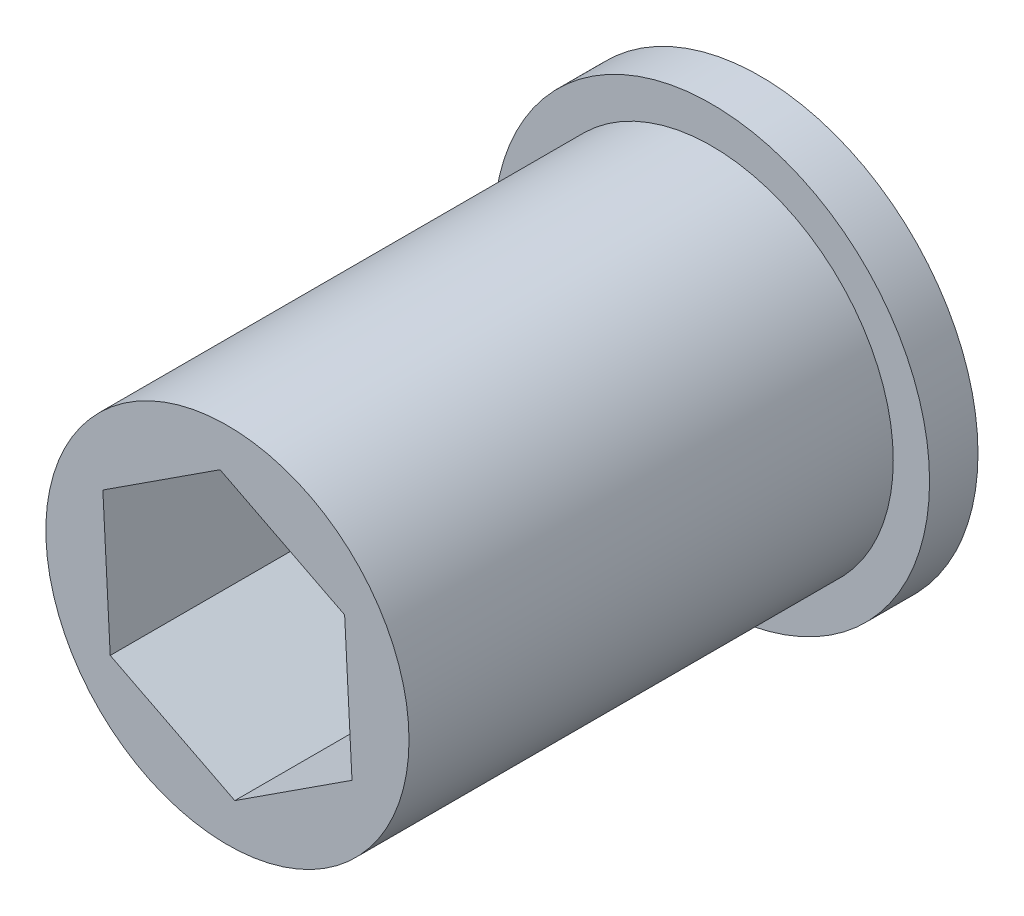
ISO-10303-21;
HEADER;
FILE_DESCRIPTION(('STEP AP214'),'2;1');
FILE_NAME('part.step','',(''),(''),'','','');
FILE_SCHEMA(('AUTOMOTIVE_DESIGN { 1 0 10303 214 1 1 1 1 }'));
ENDSEC;
DATA;
#1=APPLICATION_CONTEXT('core data for automotive mechanical design processes');
#2=APPLICATION_PROTOCOL_DEFINITION('international standard','automotive_design',2000,#1);
#3=PRODUCT_CONTEXT('',#1,'mechanical');
#4=PRODUCT('Part','Part','',(#3));
#5=PRODUCT_RELATED_PRODUCT_CATEGORY('part','',(#4));
#6=PRODUCT_DEFINITION_FORMATION('','',#4);
#7=PRODUCT_DEFINITION_CONTEXT('part definition',#1,'design');
#8=PRODUCT_DEFINITION('design','',#6,#7);
#9=PRODUCT_DEFINITION_SHAPE('','',#8);
#10=(LENGTH_UNIT() NAMED_UNIT(*) SI_UNIT(.MILLI.,.METRE.));
#11=(NAMED_UNIT(*) PLANE_ANGLE_UNIT() SI_UNIT($,.RADIAN.));
#12=(NAMED_UNIT(*) SI_UNIT($,.STERADIAN.) SOLID_ANGLE_UNIT());
#13=UNCERTAINTY_MEASURE_WITH_UNIT(LENGTH_MEASURE(1.E-05),#10,'distance_accuracy_value','');
#14=(GEOMETRIC_REPRESENTATION_CONTEXT(3) GLOBAL_UNCERTAINTY_ASSIGNED_CONTEXT((#13)) GLOBAL_UNIT_ASSIGNED_CONTEXT((#10,
#11,#12)) REPRESENTATION_CONTEXT('',''));
#15=CARTESIAN_POINT('',(0.,0.,0.));
#16=DIRECTION('',(0.,0.,1.));
#17=DIRECTION('',(1.,0.,0.));
#18=AXIS2_PLACEMENT_3D('',#15,#16,#17);
#19=CARTESIAN_POINT('',(6.34115855625894,0.334974871272549,27.94));
#20=DIRECTION('',(-0.998607646654951,-0.0527519482318975,0.));
#21=DIRECTION('',(0.0527519482318975,-0.998607646654951,0.));
#22=AXIS2_PLACEMENT_3D('',#19,#20,#21);
#23=PLANE('',#22);
#24=DIRECTION('',(-0.0527519482318975,0.998607646654951,0.));
#25=VECTOR('',#24,1.);
#26=CARTESIAN_POINT('',(6.34115855625894,0.334974871272549,0.));
#27=LINE('',#26,#25);
#28=CARTESIAN_POINT('',(6.5345563883599,-3.32609472815764,0.));
#29=VERTEX_POINT('',#28);
#30=CARTESIAN_POINT('',(6.14776072415797,3.99604447070274,0.));
#31=VERTEX_POINT('',#30);
#32=EDGE_CURVE('E120',#29,#31,#27,.T.);
#33=ORIENTED_EDGE('',*,*,#32,.F.);
#34=DIRECTION('',(0.,0.,-1.));
#35=VECTOR('',#34,1.);
#36=CARTESIAN_POINT('',(6.5345563883599,-3.32609472815764,27.94));
#37=LINE('',#36,#35);
#38=CARTESIAN_POINT('',(6.5345563883599,-3.32609472815764,27.94));
#39=VERTEX_POINT('',#38);
#40=EDGE_CURVE('E11',#39,#29,#37,.T.);
#41=ORIENTED_EDGE('',*,*,#40,.F.);
#42=DIRECTION('',(-0.0527519482318975,0.998607646654951,0.));
#43=VECTOR('',#42,1.);
#44=CARTESIAN_POINT('',(6.34115855625894,0.334974871272549,27.94));
#45=LINE('',#44,#43);
#46=CARTESIAN_POINT('',(6.14776072415797,3.99604447070274,27.94));
#47=VERTEX_POINT('',#46);
#48=EDGE_CURVE('E135',#39,#47,#45,.T.);
#49=ORIENTED_EDGE('',*,*,#48,.T.);
#50=DIRECTION('',(0.,0.,-1.));
#51=VECTOR('',#50,1.);
#52=CARTESIAN_POINT('',(6.14776072415797,3.99604447070274,27.94));
#53=LINE('',#52,#51);
#54=EDGE_CURVE('E51',#47,#31,#53,.T.);
#55=ORIENTED_EDGE('',*,*,#54,.T.);
#56=EDGE_LOOP('',(#33,#41,#49,#55));
#57=FACE_BOUND('',#56,.T.);
#58=ADVANCED_FACE('F35',(#57),#23,.T.);
#59=CARTESIAN_POINT('',(3.46067602628092,-5.32411696350902,27.94));
#60=DIRECTION('',(-0.54498835059542,0.838443616300633,0.));
#61=DIRECTION('',(-0.838443616300633,-0.54498835059542,0.));
#62=AXIS2_PLACEMENT_3D('',#59,#60,#61);
#63=PLANE('',#62);
#64=DIRECTION('',(0.838443616300633,0.54498835059542,0.));
#65=VECTOR('',#64,1.);
#66=CARTESIAN_POINT('',(3.46067602628092,-5.32411696350902,0.));
#67=LINE('',#66,#65);
#68=CARTESIAN_POINT('',(0.386795664201931,-7.32213919886039,0.));
#69=VERTEX_POINT('',#68);
#70=EDGE_CURVE('E122',#69,#29,#67,.T.);
#71=ORIENTED_EDGE('',*,*,#70,.F.);
#72=DIRECTION('',(0.,0.,-1.));
#73=VECTOR('',#72,1.);
#74=CARTESIAN_POINT('',(0.386795664201931,-7.32213919886039,27.94));
#75=LINE('',#74,#73);
#76=CARTESIAN_POINT('',(0.386795664201931,-7.32213919886039,27.94));
#77=VERTEX_POINT('',#76);
#78=EDGE_CURVE('E43',#77,#69,#75,.T.);
#79=ORIENTED_EDGE('',*,*,#78,.F.);
#80=DIRECTION('',(0.838443616300633,0.54498835059542,0.));
#81=VECTOR('',#80,1.);
#82=CARTESIAN_POINT('',(3.46067602628092,-5.32411696350902,27.94));
#83=LINE('',#82,#81);
#84=EDGE_CURVE('E241',#77,#39,#83,.T.);
#85=ORIENTED_EDGE('',*,*,#84,.T.);
#86=ORIENTED_EDGE('',*,*,#40,.T.);
#87=EDGE_LOOP('',(#71,#79,#85,#86));
#88=FACE_BOUND('',#87,.T.);
#89=ADVANCED_FACE('F144',(#88),#63,.T.);
#90=CARTESIAN_POINT('',(-2.88048252997802,-5.65909183478157,27.94));
#91=DIRECTION('',(0.453619296059531,0.891195564532531,0.));
#92=DIRECTION('',(-0.891195564532531,0.453619296059531,0.));
#93=AXIS2_PLACEMENT_3D('',#90,#91,#92);
#94=PLANE('',#93);
#95=DIRECTION('',(0.891195564532531,-0.453619296059531,0.));
#96=VECTOR('',#95,1.);
#97=CARTESIAN_POINT('',(-2.88048252997802,-5.65909183478157,0.));
#98=LINE('',#97,#96);
#99=CARTESIAN_POINT('',(-6.14776072415797,-3.99604447070275,0.));
#100=VERTEX_POINT('',#99);
#101=EDGE_CURVE('E126',#100,#69,#98,.T.);
#102=ORIENTED_EDGE('',*,*,#101,.F.);
#103=DIRECTION('',(0.,0.,-1.));
#104=VECTOR('',#103,1.);
#105=CARTESIAN_POINT('',(-6.14776072415797,-3.99604447070275,27.94));
#106=LINE('',#105,#104);
#107=CARTESIAN_POINT('',(-6.14776072415797,-3.99604447070275,27.94));
#108=VERTEX_POINT('',#107);
#109=EDGE_CURVE('E98',#108,#100,#106,.T.);
#110=ORIENTED_EDGE('',*,*,#109,.F.);
#111=DIRECTION('',(0.891195564532531,-0.453619296059531,0.));
#112=VECTOR('',#111,1.);
#113=CARTESIAN_POINT('',(-2.88048252997802,-5.65909183478157,27.94));
#114=LINE('',#113,#112);
#115=EDGE_CURVE('E109',#108,#77,#114,.T.);
#116=ORIENTED_EDGE('',*,*,#115,.T.);
#117=ORIENTED_EDGE('',*,*,#78,.T.);
#118=EDGE_LOOP('',(#102,#110,#116,#117));
#119=FACE_BOUND('',#118,.T.);
#120=ADVANCED_FACE('F141',(#119),#94,.T.);
#121=CARTESIAN_POINT('',(-6.34115855625894,-0.33497487127255,27.94));
#122=DIRECTION('',(0.998607646654951,0.0527519482318977,0.));
#123=DIRECTION('',(-0.0527519482318977,0.998607646654951,0.));
#124=AXIS2_PLACEMENT_3D('',#121,#122,#123);
#125=PLANE('',#124);
#126=DIRECTION('',(0.0527519482318977,-0.998607646654951,0.));
#127=VECTOR('',#126,1.);
#128=CARTESIAN_POINT('',(-6.34115855625894,-0.33497487127255,0.));
#129=LINE('',#128,#127);
#130=CARTESIAN_POINT('',(-6.5345563883599,3.32609472815764,0.));
#131=VERTEX_POINT('',#130);
#132=EDGE_CURVE('E94',#131,#100,#129,.T.);
#133=ORIENTED_EDGE('',*,*,#132,.F.);
#134=DIRECTION('',(0.,0.,-1.));
#135=VECTOR('',#134,1.);
#136=CARTESIAN_POINT('',(-6.5345563883599,3.32609472815764,27.94));
#137=LINE('',#136,#135);
#138=CARTESIAN_POINT('',(-6.5345563883599,3.32609472815764,27.94));
#139=VERTEX_POINT('',#138);
#140=EDGE_CURVE('E89',#139,#131,#137,.T.);
#141=ORIENTED_EDGE('',*,*,#140,.F.);
#142=DIRECTION('',(0.0527519482318977,-0.998607646654951,0.));
#143=VECTOR('',#142,1.);
#144=CARTESIAN_POINT('',(-6.34115855625894,-0.33497487127255,27.94));
#145=LINE('',#144,#143);
#146=EDGE_CURVE('E92',#139,#108,#145,.T.);
#147=ORIENTED_EDGE('',*,*,#146,.T.);
#148=ORIENTED_EDGE('',*,*,#109,.T.);
#149=EDGE_LOOP('',(#133,#141,#147,#148));
#150=FACE_BOUND('',#149,.T.);
#151=ADVANCED_FACE('F91',(#150),#125,.T.);
#152=CARTESIAN_POINT('',(-3.46067602628092,5.32411696350902,27.94));
#153=DIRECTION('',(0.544988350595421,-0.838443616300633,0.));
#154=DIRECTION('',(0.838443616300633,0.544988350595421,0.));
#155=AXIS2_PLACEMENT_3D('',#152,#153,#154);
#156=PLANE('',#155);
#157=DIRECTION('',(-0.838443616300633,-0.544988350595421,0.));
#158=VECTOR('',#157,1.);
#159=CARTESIAN_POINT('',(-3.46067602628092,5.32411696350902,0.));
#160=LINE('',#159,#158);
#161=CARTESIAN_POINT('',(-0.386795664201931,7.32213919886039,0.));
#162=VERTEX_POINT('',#161);
#163=EDGE_CURVE('E130',#162,#131,#160,.T.);
#164=ORIENTED_EDGE('',*,*,#163,.F.);
#165=DIRECTION('',(0.,0.,-1.));
#166=VECTOR('',#165,1.);
#167=CARTESIAN_POINT('',(-0.386795664201931,7.32213919886039,27.94));
#168=LINE('',#167,#166);
#169=CARTESIAN_POINT('',(-0.386795664201931,7.32213919886039,27.94));
#170=VERTEX_POINT('',#169);
#171=EDGE_CURVE('E70',#170,#162,#168,.T.);
#172=ORIENTED_EDGE('',*,*,#171,.F.);
#173=DIRECTION('',(-0.838443616300633,-0.544988350595421,0.));
#174=VECTOR('',#173,1.);
#175=CARTESIAN_POINT('',(-3.46067602628092,5.32411696350902,27.94));
#176=LINE('',#175,#174);
#177=EDGE_CURVE('E106',#170,#139,#176,.T.);
#178=ORIENTED_EDGE('',*,*,#177,.T.);
#179=ORIENTED_EDGE('',*,*,#140,.T.);
#180=EDGE_LOOP('',(#164,#172,#178,#179));
#181=FACE_BOUND('',#180,.T.);
#182=ADVANCED_FACE('F111',(#181),#156,.T.);
#183=CARTESIAN_POINT('',(2.88048252997802,5.65909183478157,27.94));
#184=DIRECTION('',(-0.453619296059531,-0.89119556453253,0.));
#185=DIRECTION('',(0.891195564532531,-0.453619296059531,0.));
#186=AXIS2_PLACEMENT_3D('',#183,#184,#185);
#187=PLANE('',#186);
#188=DIRECTION('',(-0.891195564532531,0.453619296059531,0.));
#189=VECTOR('',#188,1.);
#190=CARTESIAN_POINT('',(2.88048252997802,5.65909183478157,0.));
#191=LINE('',#190,#189);
#192=EDGE_CURVE('E132',#31,#162,#191,.T.);
#193=ORIENTED_EDGE('',*,*,#192,.F.);
#194=ORIENTED_EDGE('',*,*,#54,.F.);
#195=DIRECTION('',(-0.891195564532531,0.453619296059531,0.));
#196=VECTOR('',#195,1.);
#197=CARTESIAN_POINT('',(2.88048252997802,5.65909183478157,27.94));
#198=LINE('',#197,#196);
#199=EDGE_CURVE('E112',#47,#170,#198,.T.);
#200=ORIENTED_EDGE('',*,*,#199,.T.);
#201=ORIENTED_EDGE('',*,*,#171,.T.);
#202=EDGE_LOOP('',(#193,#194,#200,#201));
#203=FACE_BOUND('',#202,.T.);
#204=ADVANCED_FACE('F148',(#203),#187,.T.);
#205=CARTESIAN_POINT('',(0.,0.,27.94));
#206=DIRECTION('',(0.,0.,-1.));
#207=DIRECTION('',(-1.,0.,0.));
#208=AXIS2_PLACEMENT_3D('',#205,#206,#207);
#209=CYLINDRICAL_SURFACE('',#208,9.525);
#210=CARTESIAN_POINT('',(0.,0.,2.54));
#211=DIRECTION('',(0.,0.,1.));
#212=DIRECTION('',(1.,0.,0.));
#213=AXIS2_PLACEMENT_3D('',#210,#211,#212);
#214=CIRCLE('',#213,9.525);
#215=CARTESIAN_POINT('',(9.525,0.,2.54));
#216=VERTEX_POINT('',#215);
#217=EDGE_CURVE('E231',#216,#216,#214,.T.);
#218=ORIENTED_EDGE('',*,*,#217,.T.);
#219=EDGE_LOOP('',(#218));
#220=FACE_BOUND('',#219,.T.);
#221=CARTESIAN_POINT('',(0.,0.,27.94));
#222=DIRECTION('',(0.,0.,1.));
#223=DIRECTION('',(1.,0.,0.));
#224=AXIS2_PLACEMENT_3D('',#221,#222,#223);
#225=CIRCLE('',#224,9.525);
#226=CARTESIAN_POINT('',(9.525,0.,27.94));
#227=VERTEX_POINT('',#226);
#228=EDGE_CURVE('E114',#227,#227,#225,.T.);
#229=ORIENTED_EDGE('',*,*,#228,.F.);
#230=EDGE_LOOP('',(#229));
#231=FACE_BOUND('',#230,.T.);
#232=ADVANCED_FACE('F150',(#220,#231),#209,.T.);
#233=CARTESIAN_POINT('',(0.,0.,27.94));
#234=DIRECTION('',(0.,0.,1.));
#235=DIRECTION('',(1.,0.,0.));
#236=AXIS2_PLACEMENT_3D('',#233,#234,#235);
#237=PLANE('',#236);
#238=ORIENTED_EDGE('',*,*,#48,.F.);
#239=ORIENTED_EDGE('',*,*,#84,.F.);
#240=ORIENTED_EDGE('',*,*,#115,.F.);
#241=ORIENTED_EDGE('',*,*,#146,.F.);
#242=ORIENTED_EDGE('',*,*,#177,.F.);
#243=ORIENTED_EDGE('',*,*,#199,.F.);
#244=EDGE_LOOP('',(#238,#239,#240,#241,#242,#243));
#245=FACE_BOUND('',#244,.T.);
#246=ORIENTED_EDGE('',*,*,#228,.T.);
#247=EDGE_LOOP('',(#246));
#248=FACE_BOUND('',#247,.T.);
#249=ADVANCED_FACE('F103',(#245,#248),#237,.T.);
#250=CARTESIAN_POINT('',(0.,0.,0.));
#251=DIRECTION('',(0.,0.,1.));
#252=DIRECTION('',(1.,0.,0.));
#253=AXIS2_PLACEMENT_3D('',#250,#251,#252);
#254=PLANE('',#253);
#255=ORIENTED_EDGE('',*,*,#32,.T.);
#256=ORIENTED_EDGE('',*,*,#192,.T.);
#257=ORIENTED_EDGE('',*,*,#163,.T.);
#258=ORIENTED_EDGE('',*,*,#132,.T.);
#259=ORIENTED_EDGE('',*,*,#101,.T.);
#260=ORIENTED_EDGE('',*,*,#70,.T.);
#261=EDGE_LOOP('',(#255,#256,#257,#258,#259,#260));
#262=FACE_BOUND('',#261,.T.);
#263=CARTESIAN_POINT('',(0.,0.,0.));
#264=DIRECTION('',(0.,0.,1.));
#265=DIRECTION('',(1.,0.,0.));
#266=AXIS2_PLACEMENT_3D('',#263,#264,#265);
#267=CIRCLE('',#266,11.43);
#268=CARTESIAN_POINT('',(11.43,0.,0.));
#269=VERTEX_POINT('',#268);
#270=EDGE_CURVE('E235',#269,#269,#267,.T.);
#271=ORIENTED_EDGE('',*,*,#270,.F.);
#272=EDGE_LOOP('',(#271));
#273=FACE_BOUND('',#272,.T.);
#274=ADVANCED_FACE('F146',(#262,#273),#254,.F.);
#275=CARTESIAN_POINT('',(0.,0.,2.54));
#276=DIRECTION('',(0.,0.,-1.));
#277=DIRECTION('',(-1.,0.,0.));
#278=AXIS2_PLACEMENT_3D('',#275,#276,#277);
#279=CYLINDRICAL_SURFACE('',#278,11.43);
#280=CARTESIAN_POINT('',(0.,0.,2.54));
#281=DIRECTION('',(0.,0.,1.));
#282=DIRECTION('',(1.,0.,0.));
#283=AXIS2_PLACEMENT_3D('',#280,#281,#282);
#284=CIRCLE('',#283,11.43);
#285=CARTESIAN_POINT('',(11.43,0.,2.54));
#286=VERTEX_POINT('',#285);
#287=EDGE_CURVE('E123',#286,#286,#284,.T.);
#288=ORIENTED_EDGE('',*,*,#287,.F.);
#289=EDGE_LOOP('',(#288));
#290=FACE_BOUND('',#289,.T.);
#291=ORIENTED_EDGE('',*,*,#270,.T.);
#292=EDGE_LOOP('',(#291));
#293=FACE_BOUND('',#292,.T.);
#294=ADVANCED_FACE('F205',(#290,#293),#279,.T.);
#295=CARTESIAN_POINT('',(0.,0.,2.54));
#296=DIRECTION('',(0.,0.,1.));
#297=DIRECTION('',(1.,0.,0.));
#298=AXIS2_PLACEMENT_3D('',#295,#296,#297);
#299=PLANE('',#298);
#300=ORIENTED_EDGE('',*,*,#217,.F.);
#301=EDGE_LOOP('',(#300));
#302=FACE_BOUND('',#301,.T.);
#303=ORIENTED_EDGE('',*,*,#287,.T.);
#304=EDGE_LOOP('',(#303));
#305=FACE_BOUND('',#304,.T.);
#306=ADVANCED_FACE('F214',(#302,#305),#299,.T.);
#307=CLOSED_SHELL('',(#58,#89,#120,#151,#182,#204,#232,#249,#274,#294,#306));
#308=MANIFOLD_SOLID_BREP('B2',#307);
#309=ADVANCED_BREP_SHAPE_REPRESENTATION('',(#18,#308),#14);
#310=SHAPE_DEFINITION_REPRESENTATION(#9,#309);
ENDSEC;
END-ISO-10303-21;
